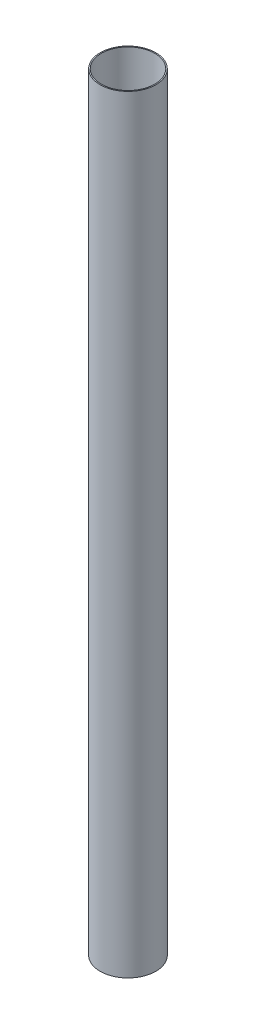
ISO-10303-21;
HEADER;
FILE_DESCRIPTION(('STEP AP214'),'2;1');
FILE_NAME('part.step','',(''),(''),'','','');
FILE_SCHEMA(('AUTOMOTIVE_DESIGN { 1 0 10303 214 1 1 1 1 }'));
ENDSEC;
DATA;
#1=APPLICATION_CONTEXT('core data for automotive mechanical design processes');
#2=APPLICATION_PROTOCOL_DEFINITION('international standard','automotive_design',2000,#1);
#3=PRODUCT_CONTEXT('',#1,'mechanical');
#4=PRODUCT('Part','Part','',(#3));
#5=PRODUCT_RELATED_PRODUCT_CATEGORY('part','',(#4));
#6=PRODUCT_DEFINITION_FORMATION('','',#4);
#7=PRODUCT_DEFINITION_CONTEXT('part definition',#1,'design');
#8=PRODUCT_DEFINITION('design','',#6,#7);
#9=PRODUCT_DEFINITION_SHAPE('','',#8);
#10=(LENGTH_UNIT() NAMED_UNIT(*) SI_UNIT(.MILLI.,.METRE.));
#11=(NAMED_UNIT(*) PLANE_ANGLE_UNIT() SI_UNIT($,.RADIAN.));
#12=(NAMED_UNIT(*) SI_UNIT($,.STERADIAN.) SOLID_ANGLE_UNIT());
#13=UNCERTAINTY_MEASURE_WITH_UNIT(LENGTH_MEASURE(1.E-05),#10,'distance_accuracy_value','');
#14=(GEOMETRIC_REPRESENTATION_CONTEXT(3) GLOBAL_UNCERTAINTY_ASSIGNED_CONTEXT((#13)) GLOBAL_UNIT_ASSIGNED_CONTEXT((#10,
#11,#12)) REPRESENTATION_CONTEXT('',''));
#15=CARTESIAN_POINT('',(0.,0.,0.));
#16=DIRECTION('',(0.,0.,1.));
#17=DIRECTION('',(1.,0.,0.));
#18=AXIS2_PLACEMENT_3D('',#15,#16,#17);
#19=CARTESIAN_POINT('',(0.,1422.4,0.));
#20=DIRECTION('',(0.,1.,0.));
#21=DIRECTION('',(0.,0.,1.));
#22=AXIS2_PLACEMENT_3D('',#19,#20,#21);
#23=PLANE('',#22);
#24=CARTESIAN_POINT('',(0.,1422.4,0.));
#25=DIRECTION('',(0.,1.,0.));
#26=DIRECTION('',(0.,0.,1.));
#27=AXIS2_PLACEMENT_3D('',#24,#25,#26);
#28=CIRCLE('',#27,51.562);
#29=CARTESIAN_POINT('',(0.,1422.4,51.562));
#30=VERTEX_POINT('',#29);
#31=EDGE_CURVE('E10',#30,#30,#28,.T.);
#32=ORIENTED_EDGE('',*,*,#31,.T.);
#33=EDGE_LOOP('',(#32));
#34=FACE_BOUND('',#33,.T.);
#35=CARTESIAN_POINT('',(0.,1422.4,0.));
#36=DIRECTION('',(0.,1.,0.));
#37=DIRECTION('',(0.,0.,1.));
#38=AXIS2_PLACEMENT_3D('',#35,#36,#37);
#39=CIRCLE('',#38,49.53);
#40=CARTESIAN_POINT('',(0.,1422.4,49.53));
#41=VERTEX_POINT('',#40);
#42=EDGE_CURVE('E43',#41,#41,#39,.T.);
#43=ORIENTED_EDGE('',*,*,#42,.F.);
#44=EDGE_LOOP('',(#43));
#45=FACE_BOUND('',#44,.T.);
#46=ADVANCED_FACE('F32',(#34,#45),#23,.T.);
#47=CARTESIAN_POINT('',(0.,0.,0.));
#48=DIRECTION('',(0.,1.,0.));
#49=DIRECTION('',(0.,0.,1.));
#50=AXIS2_PLACEMENT_3D('',#47,#48,#49);
#51=PLANE('',#50);
#52=CARTESIAN_POINT('',(0.,0.,0.));
#53=DIRECTION('',(0.,1.,0.));
#54=DIRECTION('',(0.,0.,1.));
#55=AXIS2_PLACEMENT_3D('',#52,#53,#54);
#56=CIRCLE('',#55,51.562);
#57=CARTESIAN_POINT('',(0.,0.,51.562));
#58=VERTEX_POINT('',#57);
#59=EDGE_CURVE('E36',#58,#58,#56,.T.);
#60=ORIENTED_EDGE('',*,*,#59,.F.);
#61=EDGE_LOOP('',(#60));
#62=FACE_BOUND('',#61,.T.);
#63=CARTESIAN_POINT('',(0.,0.,0.));
#64=DIRECTION('',(0.,1.,0.));
#65=DIRECTION('',(0.,0.,1.));
#66=AXIS2_PLACEMENT_3D('',#63,#64,#65);
#67=CIRCLE('',#66,49.53);
#68=CARTESIAN_POINT('',(0.,0.,49.53));
#69=VERTEX_POINT('',#68);
#70=EDGE_CURVE('E45',#69,#69,#67,.T.);
#71=ORIENTED_EDGE('',*,*,#70,.T.);
#72=EDGE_LOOP('',(#71));
#73=FACE_BOUND('',#72,.T.);
#74=ADVANCED_FACE('F55',(#62,#73),#51,.F.);
#75=CARTESIAN_POINT('',(0.,1422.4,0.));
#76=DIRECTION('',(0.,-1.,0.));
#77=DIRECTION('',(0.,0.,-1.));
#78=AXIS2_PLACEMENT_3D('',#75,#76,#77);
#79=CYLINDRICAL_SURFACE('',#78,51.562);
#80=ORIENTED_EDGE('',*,*,#31,.F.);
#81=EDGE_LOOP('',(#80));
#82=FACE_BOUND('',#81,.T.);
#83=ORIENTED_EDGE('',*,*,#59,.T.);
#84=EDGE_LOOP('',(#83));
#85=FACE_BOUND('',#84,.T.);
#86=ADVANCED_FACE('F34',(#82,#85),#79,.T.);
#87=CARTESIAN_POINT('',(0.,1422.4,0.));
#88=DIRECTION('',(0.,-1.,0.));
#89=DIRECTION('',(0.,0.,-1.));
#90=AXIS2_PLACEMENT_3D('',#87,#88,#89);
#91=CYLINDRICAL_SURFACE('',#90,49.53);
#92=ORIENTED_EDGE('',*,*,#42,.T.);
#93=EDGE_LOOP('',(#92));
#94=FACE_BOUND('',#93,.T.);
#95=ORIENTED_EDGE('',*,*,#70,.F.);
#96=EDGE_LOOP('',(#95));
#97=FACE_BOUND('',#96,.T.);
#98=ADVANCED_FACE('F51',(#94,#97),#91,.F.);
#99=CLOSED_SHELL('',(#46,#74,#86,#98));
#100=MANIFOLD_SOLID_BREP('B2',#99);
#101=ADVANCED_BREP_SHAPE_REPRESENTATION('',(#18,#100),#14);
#102=SHAPE_DEFINITION_REPRESENTATION(#9,#101);
ENDSEC;
END-ISO-10303-21;
